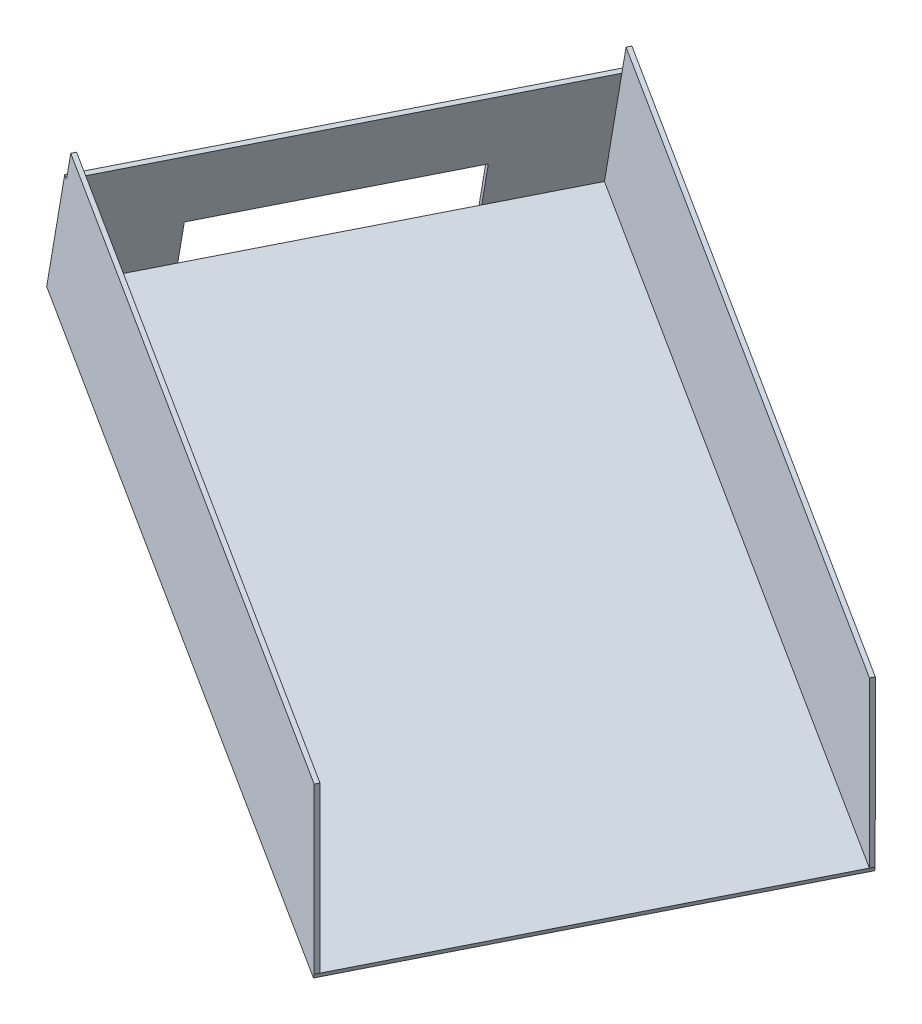
ISO-10303-21;
HEADER;
FILE_DESCRIPTION(('STEP AP214'),'2;1');
FILE_NAME('part.step','',(''),(''),'','','');
FILE_SCHEMA(('AUTOMOTIVE_DESIGN { 1 0 10303 214 1 1 1 1 }'));
ENDSEC;
DATA;
#1=APPLICATION_CONTEXT('core data for automotive mechanical design processes');
#2=APPLICATION_PROTOCOL_DEFINITION('international standard','automotive_design',2000,#1);
#3=PRODUCT_CONTEXT('',#1,'mechanical');
#4=PRODUCT('Part','Part','',(#3));
#5=PRODUCT_RELATED_PRODUCT_CATEGORY('part','',(#4));
#6=PRODUCT_DEFINITION_FORMATION('','',#4);
#7=PRODUCT_DEFINITION_CONTEXT('part definition',#1,'design');
#8=PRODUCT_DEFINITION('design','',#6,#7);
#9=PRODUCT_DEFINITION_SHAPE('','',#8);
#10=(LENGTH_UNIT() NAMED_UNIT(*) SI_UNIT(.MILLI.,.METRE.));
#11=(NAMED_UNIT(*) PLANE_ANGLE_UNIT() SI_UNIT($,.RADIAN.));
#12=(NAMED_UNIT(*) SI_UNIT($,.STERADIAN.) SOLID_ANGLE_UNIT());
#13=UNCERTAINTY_MEASURE_WITH_UNIT(LENGTH_MEASURE(1.E-05),#10,'distance_accuracy_value','');
#14=(GEOMETRIC_REPRESENTATION_CONTEXT(3) GLOBAL_UNCERTAINTY_ASSIGNED_CONTEXT((#13)) GLOBAL_UNIT_ASSIGNED_CONTEXT((#10,
#11,#12)) REPRESENTATION_CONTEXT('',''));
#15=CARTESIAN_POINT('',(0.,0.,0.));
#16=DIRECTION('',(0.,0.,1.));
#17=DIRECTION('',(1.,0.,0.));
#18=AXIS2_PLACEMENT_3D('',#15,#16,#17);
#19=CARTESIAN_POINT('',(-1582.31352976464,1675.1024913137,-8281.54614075704));
#20=DIRECTION('',(-0.849422273475724,0.310266919073999,-0.426867942403339));
#21=DIRECTION('',(-0.449027691255792,0.,0.893517841167983));
#22=AXIS2_PLACEMENT_3D('',#19,#20,#21);
#23=PLANE('',#22);
#24=DIRECTION('',(-0.449027691255792,0.,0.893517841167983));
#25=VECTOR('',#24,1.);
#26=CARTESIAN_POINT('',(-4783.0423725863,999.259321987561,-2403.66602074069));
#27=LINE('',#26,#25);
#28=CARTESIAN_POINT('',(-2297.24573428667,999.259321987562,-7350.13967724141));
#29=VERTEX_POINT('',#28);
#30=CARTESIAN_POINT('',(-2445.51467793934,999.259321987562,-7055.10008608774));
#31=VERTEX_POINT('',#30);
#32=EDGE_CURVE('E184',#29,#31,#27,.T.);
#33=ORIENTED_EDGE('',*,*,#32,.T.);
#34=DIRECTION('',(-0.277229027716841,-0.950649482684511,-0.139318438344846));
#35=VECTOR('',#34,1.);
#36=CARTESIAN_POINT('',(-2248.42484816079,1675.10249131371,-6956.05473169417));
#37=LINE('',#36,#35);
#38=CARTESIAN_POINT('',(-2466.63952985136,926.819831407002,-7065.71615108962));
#39=VERTEX_POINT('',#38);
#40=EDGE_CURVE('E178',#31,#39,#37,.T.);
#41=ORIENTED_EDGE('',*,*,#40,.T.);
#42=DIRECTION('',(-0.449027691255792,0.,0.893517841167983));
#43=VECTOR('',#42,1.);
#44=CARTESIAN_POINT('',(-1800.52821145521,926.819831407,-8391.20756015249));
#45=LINE('',#44,#43);
#46=CARTESIAN_POINT('',(-2529.36869831979,926.819831407,-6940.89170867845));
#47=VERTEX_POINT('',#46);
#48=EDGE_CURVE('E175',#39,#47,#45,.T.);
#49=ORIENTED_EDGE('',*,*,#48,.T.);
#50=DIRECTION('',(-0.277229027716841,-0.950649482684511,-0.139318438344846));
#51=VECTOR('',#50,1.);
#52=CARTESIAN_POINT('',(-2311.15401662922,1675.1024913137,-6831.23028928301));
#53=LINE('',#52,#51);
#54=CARTESIAN_POINT('',(-2476.55656853973,1107.9185578584,-6914.35154617376));
#55=VERTEX_POINT('',#54);
#56=EDGE_CURVE('E337',#55,#47,#53,.T.);
#57=ORIENTED_EDGE('',*,*,#56,.F.);
#58=DIRECTION('',(-0.449027691255792,0.,0.893517841167983));
#59=VECTOR('',#58,1.);
#60=CARTESIAN_POINT('',(-1747.71608167515,1107.9185578584,-8364.66739764779));
#61=LINE('',#60,#59);
#62=CARTESIAN_POINT('',(-2202.8292879502,1107.9185578584,-7459.04002214976));
#63=VERTEX_POINT('',#62);
#64=EDGE_CURVE('E263',#63,#55,#61,.T.);
#65=ORIENTED_EDGE('',*,*,#64,.F.);
#66=DIRECTION('',(0.277229027716841,0.950649482684511,0.139318438344846));
#67=VECTOR('',#66,1.);
#68=CARTESIAN_POINT('',(-2037.42673603969,1675.1024913137,-7375.91876525901));
#69=LINE('',#68,#67);
#70=CARTESIAN_POINT('',(-2255.64141773026,926.819831407,-7485.58018465445));
#71=VERTEX_POINT('',#70);
#72=EDGE_CURVE('E44',#71,#63,#69,.T.);
#73=ORIENTED_EDGE('',*,*,#72,.F.);
#74=CARTESIAN_POINT('',(-2318.37058619869,926.819831407,-7360.75574224329));
#75=VERTEX_POINT('',#74);
#76=EDGE_CURVE('E245',#71,#75,#45,.T.);
#77=ORIENTED_EDGE('',*,*,#76,.T.);
#78=DIRECTION('',(0.277229027716841,0.950649482684511,0.139318438344846));
#79=VECTOR('',#78,1.);
#80=CARTESIAN_POINT('',(-2100.15590450812,1675.10249131371,-7251.09432284784));
#81=LINE('',#80,#79);
#82=EDGE_CURVE('E52',#75,#29,#81,.T.);
#83=ORIENTED_EDGE('',*,*,#82,.T.);
#84=EDGE_LOOP('',(#33,#41,#49,#57,#65,#73,#77,#83));
#85=FACE_BOUND('',#84,.T.);
#86=ADVANCED_FACE('F35',(#85),#23,.T.);
#87=CARTESIAN_POINT('',(2785.42433135297,-748.282659905749,-6086.58689380516));
#88=DIRECTION('',(-0.277229027716676,-0.950649482684571,-0.139318438344762));
#89=DIRECTION('',(0.960011871714968,-0.279959293766653,0.));
#90=AXIS2_PLACEMENT_3D('',#87,#88,#89);
#91=PLANE('',#90);
#92=ORIENTED_EDGE('',*,*,#48,.F.);
#93=DIRECTION('',(-0.849422273475724,0.310266919073999,-0.426867942403339));
#94=VECTOR('',#93,1.);
#95=CARTESIAN_POINT('',(-2158.09937485804,814.119933735756,-6910.66264563834));
#96=LINE('',#95,#94);
#97=CARTESIAN_POINT('',(-2461.24569841478,924.84963647088,-7063.00553965536));
#98=VERTEX_POINT('',#97);
#99=EDGE_CURVE('E159',#98,#39,#96,.T.);
#100=ORIENTED_EDGE('',*,*,#99,.F.);
#101=DIRECTION('',(-0.449027691255792,0.,0.893517841167983));
#102=VECTOR('',#101,1.);
#103=CARTESIAN_POINT('',(-4798.77339306175,924.84963647088,-2411.5714743083));
#104=LINE('',#103,#102);
#105=CARTESIAN_POINT('',(-2312.97675476212,924.84963647088,-7358.04513080903));
#106=VERTEX_POINT('',#105);
#107=EDGE_CURVE('E166',#106,#98,#104,.T.);
#108=ORIENTED_EDGE('',*,*,#107,.F.);
#109=DIRECTION('',(-0.849422273475724,0.310266919073999,-0.426867942403339));
#110=VECTOR('',#109,1.);
#111=CARTESIAN_POINT('',(-2009.83043120538,814.119933735756,-7205.70223679201));
#112=LINE('',#111,#110);
#113=EDGE_CURVE('E182',#106,#75,#112,.T.);
#114=ORIENTED_EDGE('',*,*,#113,.T.);
#115=ORIENTED_EDGE('',*,*,#76,.F.);
#116=DIRECTION('',(-0.849422273475778,0.310266919073814,-0.426867942403366));
#117=VECTOR('',#116,1.);
#118=CARTESIAN_POINT('',(2330.31112507791,-748.282659905749,-5180.95951830712));
#119=LINE('',#118,#117);
#120=CARTESIAN_POINT('',(-1473.53585942748,641.141565669802,-7092.54152668658));
#121=VERTEX_POINT('',#120);
#122=EDGE_CURVE('E11',#121,#71,#119,.T.);
#123=ORIENTED_EDGE('',*,*,#122,.F.);
#124=DIRECTION('',(-0.449027691255792,0.,0.893517841167983));
#125=VECTOR('',#124,1.);
#126=CARTESIAN_POINT('',(-1018.42265315243,641.141565669801,-7998.16890218461));
#127=LINE('',#126,#125);
#128=CARTESIAN_POINT('',(-1747.26314001701,641.141565669801,-6547.85305071058));
#129=VERTEX_POINT('',#128);
#130=EDGE_CURVE('E239',#121,#129,#127,.T.);
#131=ORIENTED_EDGE('',*,*,#130,.T.);
#132=DIRECTION('',(0.849422273475778,-0.310266919073814,0.426867942403366));
#133=VECTOR('',#132,1.);
#134=CARTESIAN_POINT('',(2056.58384448839,-748.282659905749,-4636.27104233112));
#135=LINE('',#134,#133);
#136=EDGE_CURVE('E339',#47,#129,#135,.T.);
#137=ORIENTED_EDGE('',*,*,#136,.F.);
#138=EDGE_LOOP('',(#92,#100,#108,#114,#115,#123,#131,#137));
#139=FACE_BOUND('',#138,.T.);
#140=ADVANCED_FACE('F173',(#139),#91,.T.);
#141=CARTESIAN_POINT('',(-1584.23978256921,1673.1322963776,-8264.26933219134));
#142=DIRECTION('',(0.849422273475723,-0.310266919074003,0.426867942403338));
#143=DIRECTION('',(0.449027691255792,0.,-0.893517841167983));
#144=AXIS2_PLACEMENT_3D('',#141,#142,#143);
#145=PLANE('',#144);
#146=DIRECTION('',(-0.449027691255792,0.,0.893517841167983));
#147=VECTOR('',#146,1.);
#148=CARTESIAN_POINT('',(-1800.69405993377,930.886260685959,-8373.0460795033));
#149=LINE('',#148,#147);
#150=CARTESIAN_POINT('',(-2459.48529408879,930.886260685959,-7062.12086757187));
#151=VERTEX_POINT('',#150);
#152=CARTESIAN_POINT('',(-2519.36313671775,930.886260685959,-6942.97026345212));
#153=VERTEX_POINT('',#152);
#154=EDGE_CURVE('E38',#151,#153,#149,.T.);
#155=ORIENTED_EDGE('',*,*,#154,.F.);
#156=DIRECTION('',(-0.277229027716844,-0.95064948268451,-0.139318438344848));
#157=VECTOR('',#156,1.);
#158=CARTESIAN_POINT('',(-2243.03101672421,1673.13229637759,-6953.34412025991));
#159=LINE('',#158,#157);
#160=CARTESIAN_POINT('',(-2440.12084650276,997.28912705144,-7052.38947465348));
#161=VERTEX_POINT('',#160);
#162=EDGE_CURVE('E60',#161,#151,#159,.T.);
#163=ORIENTED_EDGE('',*,*,#162,.F.);
#164=DIRECTION('',(-0.449027691255792,0.,0.893517841167983));
#165=VECTOR('',#164,1.);
#166=CARTESIAN_POINT('',(-4777.64854114973,997.289127051439,-2400.95540930642));
#167=LINE('',#166,#165);
#168=CARTESIAN_POINT('',(-2291.8519028501,997.28912705144,-7347.42906580715));
#169=VERTEX_POINT('',#168);
#170=EDGE_CURVE('E163',#169,#161,#167,.T.);
#171=ORIENTED_EDGE('',*,*,#170,.F.);
#172=DIRECTION('',(0.277229027716844,0.95064948268451,0.139318438344848));
#173=VECTOR('',#172,1.);
#174=CARTESIAN_POINT('',(-2094.76207307155,1673.13229637759,-7248.38371141358));
#175=LINE('',#174,#173);
#176=CARTESIAN_POINT('',(-2311.21635043611,930.886260685955,-7357.16045872553));
#177=VERTEX_POINT('',#176);
#178=EDGE_CURVE('E308',#177,#169,#175,.T.);
#179=ORIENTED_EDGE('',*,*,#178,.F.);
#180=CARTESIAN_POINT('',(-2251.33850780716,930.886260685959,-7476.31106284529));
#181=VERTEX_POINT('',#180);
#182=EDGE_CURVE('E212',#181,#177,#149,.T.);
#183=ORIENTED_EDGE('',*,*,#182,.F.);
#184=DIRECTION('',(-0.277229027716844,-0.95064948268451,-0.139318438344847));
#185=VECTOR('',#184,1.);
#186=CARTESIAN_POINT('',(-2034.8842304426,1673.1322963776,-7367.53431553333));
#187=LINE('',#186,#185);
#188=CARTESIAN_POINT('',(-2200.28678235312,1105.94836292228,-7450.65557242409));
#189=VERTEX_POINT('',#188);
#190=EDGE_CURVE('E198',#189,#181,#187,.T.);
#191=ORIENTED_EDGE('',*,*,#190,.F.);
#192=DIRECTION('',(0.449027691255792,0.,-0.893517841167983));
#193=VECTOR('',#192,1.);
#194=CARTESIAN_POINT('',(-1742.32225023859,1105.94836292228,-8361.95678621354));
#195=LINE('',#194,#193);
#196=CARTESIAN_POINT('',(-2468.3114112637,1105.94836292228,-6917.31477303092));
#197=VERTEX_POINT('',#196);
#198=EDGE_CURVE('E194',#197,#189,#195,.T.);
#199=ORIENTED_EDGE('',*,*,#198,.F.);
#200=DIRECTION('',(0.277229027716845,0.95064948268451,0.139318438344847));
#201=VECTOR('',#200,1.);
#202=CARTESIAN_POINT('',(-2302.90885935318,1673.1322963776,-6834.19351614016));
#203=LINE('',#202,#201);
#204=EDGE_CURVE('E223',#153,#197,#203,.T.);
#205=ORIENTED_EDGE('',*,*,#204,.F.);
#206=EDGE_LOOP('',(#155,#163,#171,#179,#183,#191,#199,#205));
#207=FACE_BOUND('',#206,.T.);
#208=ADVANCED_FACE('F306',(#207),#145,.T.);
#209=CARTESIAN_POINT('',(-1576.91969832807,1673.13229637761,-8278.83552932278));
#210=DIRECTION('',(-0.849422273475723,0.310266919074003,-0.426867942403338));
#211=DIRECTION('',(-0.449027691255792,0.,0.893517841167983));
#212=AXIS2_PLACEMENT_3D('',#209,#210,#211);
#213=PLANE('',#212);
#214=DIRECTION('',(-0.449027691255792,0.,0.893517841167983));
#215=VECTOR('',#214,1.);
#216=CARTESIAN_POINT('',(-1729.99941995657,1148.20473242763,-8355.76408162911));
#217=LINE('',#216,#215);
#218=CARTESIAN_POINT('',(-2455.98858098168,1148.20473242763,-6911.12206844649));
#219=VERTEX_POINT('',#218);
#220=CARTESIAN_POINT('',(-2458.83990682115,1148.20473242763,-6905.44823015507));
#221=VERTEX_POINT('',#220);
#222=EDGE_CURVE('E277',#219,#221,#217,.T.);
#223=ORIENTED_EDGE('',*,*,#222,.F.);
#224=EDGE_CURVE('E326',#197,#219,#203,.T.);
#225=ORIENTED_EDGE('',*,*,#224,.F.);
#226=DIRECTION('',(-0.449027691255792,0.,0.893517841167983));
#227=VECTOR('',#226,1.);
#228=CARTESIAN_POINT('',(-1742.32225023859,1105.94836292228,-8361.95678621354));
#229=LINE('',#228,#227);
#230=CARTESIAN_POINT('',(-2471.16273710317,1105.94836292228,-6911.6409347395));
#231=VERTEX_POINT('',#230);
#232=EDGE_CURVE('E267',#197,#231,#229,.T.);
#233=ORIENTED_EDGE('',*,*,#232,.T.);
#234=DIRECTION('',(-0.277229027716844,-0.95064948268451,-0.139318438344847));
#235=VECTOR('',#234,1.);
#236=CARTESIAN_POINT('',(-2305.76018519265,1673.13229637761,-6828.51967784875));
#237=LINE('',#236,#235);
#238=EDGE_CURVE('E253',#221,#231,#237,.T.);
#239=ORIENTED_EDGE('',*,*,#238,.F.);
#240=EDGE_LOOP('',(#223,#225,#233,#239));
#241=FACE_BOUND('',#240,.T.);
#242=ADVANCED_FACE('F331',(#241),#213,.T.);
#243=CARTESIAN_POINT('',(-2197.43545651364,1105.94836292228,-7456.3294107155));
#244=VERTEX_POINT('',#243);
#245=EDGE_CURVE('E265',#244,#189,#229,.T.);
#246=ORIENTED_EDGE('',*,*,#245,.T.);
#247=CARTESIAN_POINT('',(-2187.9639520711,1148.20473242763,-7444.46286783966));
#248=VERTEX_POINT('',#247);
#249=EDGE_CURVE('E201',#248,#189,#187,.T.);
#250=ORIENTED_EDGE('',*,*,#249,.F.);
#251=CARTESIAN_POINT('',(-2185.1126262316,1148.20473242763,-7450.13670613106));
#252=VERTEX_POINT('',#251);
#253=EDGE_CURVE('E234',#252,#248,#217,.T.);
#254=ORIENTED_EDGE('',*,*,#253,.F.);
#255=DIRECTION('',(0.277229027716844,0.95064948268451,0.139318438344847));
#256=VECTOR('',#255,1.);
#257=CARTESIAN_POINT('',(-2032.03290460312,1673.13229637761,-7373.20815382475));
#258=LINE('',#257,#256);
#259=EDGE_CURVE('E366',#244,#252,#258,.T.);
#260=ORIENTED_EDGE('',*,*,#259,.F.);
#261=EDGE_LOOP('',(#246,#250,#254,#260));
#262=FACE_BOUND('',#261,.T.);
#263=ADVANCED_FACE('F300',(#262),#213,.T.);
#264=CARTESIAN_POINT('',(2850.55929141462,-524.927563949967,-6053.85402671625));
#265=DIRECTION('',(0.277229027716844,0.95064948268451,0.139318438344847));
#266=DIRECTION('',(-0.960011871714918,0.279959293766827,0.));
#267=AXIS2_PLACEMENT_3D('',#264,#265,#266);
#268=PLANE('',#267);
#269=DIRECTION('',(-0.449027691255792,0.,0.893517841167983));
#270=VECTOR('',#269,1.);
#271=CARTESIAN_POINT('',(-1016.37992767892,887.542246672293,-7997.14235267326));
#272=LINE('',#271,#270);
#273=CARTESIAN_POINT('',(-1742.36908870403,887.542246672293,-6552.50033949064));
#274=VERTEX_POINT('',#273);
#275=CARTESIAN_POINT('',(-1745.22041454351,887.542246672293,-6546.82650119922));
#276=VERTEX_POINT('',#275);
#277=EDGE_CURVE('E225',#274,#276,#272,.T.);
#278=ORIENTED_EDGE('',*,*,#277,.F.);
#279=DIRECTION('',(-0.849422273475732,0.310266919073972,-0.426867942403343));
#280=VECTOR('',#279,1.);
#281=CARTESIAN_POINT('',(2124.57013038957,-524.927563949814,-4609.2120135336));
#282=LINE('',#281,#280);
#283=EDGE_CURVE('E187',#274,#219,#282,.T.);
#284=ORIENTED_EDGE('',*,*,#283,.T.);
#285=ORIENTED_EDGE('',*,*,#222,.T.);
#286=DIRECTION('',(-0.849422273475723,0.310266919074003,-0.426867942403338));
#287=VECTOR('',#286,1.);
#288=CARTESIAN_POINT('',(2121.71880455004,-524.927563949967,-4603.53817524221));
#289=LINE('',#288,#287);
#290=EDGE_CURVE('E259',#276,#221,#289,.T.);
#291=ORIENTED_EDGE('',*,*,#290,.F.);
#292=EDGE_LOOP('',(#278,#284,#285,#291));
#293=FACE_BOUND('',#292,.T.);
#294=ADVANCED_FACE('F353',(#293),#268,.T.);
#295=ORIENTED_EDGE('',*,*,#253,.T.);
#296=DIRECTION('',(0.849422273475732,-0.310266919073972,0.426867942403343));
#297=VECTOR('',#296,1.);
#298=CARTESIAN_POINT('',(2392.59475930015,-524.927563949814,-5142.55281292677));
#299=LINE('',#298,#297);
#300=CARTESIAN_POINT('',(-1474.34445979345,887.542246672293,-7085.8411388838));
#301=VERTEX_POINT('',#300);
#302=EDGE_CURVE('E190',#248,#301,#299,.T.);
#303=ORIENTED_EDGE('',*,*,#302,.T.);
#304=CARTESIAN_POINT('',(-1471.49313395398,887.542246672293,-7091.51497717522));
#305=VERTEX_POINT('',#304);
#306=EDGE_CURVE('E228',#305,#301,#272,.T.);
#307=ORIENTED_EDGE('',*,*,#306,.F.);
#308=DIRECTION('',(0.849422273475723,-0.310266919074003,0.426867942403339));
#309=VECTOR('',#308,1.);
#310=CARTESIAN_POINT('',(2395.44608513957,-524.927563949967,-5148.22665121822));
#311=LINE('',#310,#309);
#312=EDGE_CURVE('E294',#252,#305,#311,.T.);
#313=ORIENTED_EDGE('',*,*,#312,.F.);
#314=EDGE_LOOP('',(#295,#303,#307,#313));
#315=FACE_BOUND('',#314,.T.);
#316=ADVANCED_FACE('F293',(#315),#268,.T.);
#317=CARTESIAN_POINT('',(-1017.41544778491,5.91571691095366,-7997.66274206115));
#318=DIRECTION('',(0.893517069173879,-0.00131452933249969,0.449027303298536));
#319=DIRECTION('',(0.449027691255792,0.,-0.893517841167983));
#320=AXIS2_PLACEMENT_3D('',#317,#318,#319);
#321=PLANE('',#320);
#322=DIRECTION('',(-0.449027691255792,0.,0.893517841167983));
#323=VECTOR('',#322,1.);
#324=CARTESIAN_POINT('',(-1016.66224882644,647.178189884691,-7997.28423010113));
#325=LINE('',#324,#323);
#326=CARTESIAN_POINT('',(-1742.65140985155,647.178189884813,-6552.64221691851));
#327=VERTEX_POINT('',#326);
#328=CARTESIAN_POINT('',(-1745.50273569102,647.178189884691,-6546.96837862709));
#329=VERTEX_POINT('',#328);
#330=EDGE_CURVE('E242',#327,#329,#325,.T.);
#331=ORIENTED_EDGE('',*,*,#330,.F.);
#332=DIRECTION('',(-0.00117455541172512,-0.999999136005943,-0.00059026007146012));
#333=VECTOR('',#332,1.);
#334=CARTESIAN_POINT('',(-1743.40460881027,5.91571691295644,-6553.02072887866));
#335=LINE('',#334,#333);
#336=EDGE_CURVE('E318',#274,#327,#335,.T.);
#337=ORIENTED_EDGE('',*,*,#336,.F.);
#338=ORIENTED_EDGE('',*,*,#277,.T.);
#339=DIRECTION('',(0.00117455541132706,0.999999136005944,0.000590260071260452));
#340=VECTOR('',#339,1.);
#341=CARTESIAN_POINT('',(-1746.25593464949,5.91571691095366,-6547.34689058712));
#342=LINE('',#341,#340);
#343=EDGE_CURVE('E348',#329,#276,#342,.T.);
#344=ORIENTED_EDGE('',*,*,#343,.F.);
#345=EDGE_LOOP('',(#331,#337,#338,#344));
#346=FACE_BOUND('',#345,.T.);
#347=ADVANCED_FACE('F355',(#346),#321,.T.);
#348=ORIENTED_EDGE('',*,*,#306,.T.);
#349=DIRECTION('',(0.00117455541172502,0.999999136005943,0.000590260071460319));
#350=VECTOR('',#349,1.);
#351=CARTESIAN_POINT('',(-1475.37997989969,5.91571691295644,-7086.36152827183));
#352=LINE('',#351,#350);
#353=CARTESIAN_POINT('',(-1474.62678094096,647.178189884691,-7085.98301631167));
#354=VERTEX_POINT('',#353);
#355=EDGE_CURVE('E195',#354,#301,#352,.T.);
#356=ORIENTED_EDGE('',*,*,#355,.F.);
#357=CARTESIAN_POINT('',(-1471.77545510153,647.178189884691,-7091.65685460311));
#358=VERTEX_POINT('',#357);
#359=EDGE_CURVE('E229',#358,#354,#325,.T.);
#360=ORIENTED_EDGE('',*,*,#359,.F.);
#361=DIRECTION('',(-0.00117455541132711,-0.999999136005944,-0.000590260071260353));
#362=VECTOR('',#361,1.);
#363=CARTESIAN_POINT('',(-1472.52865405996,5.91571691095366,-7092.03536656312));
#364=LINE('',#363,#362);
#365=EDGE_CURVE('E292',#305,#358,#364,.T.);
#366=ORIENTED_EDGE('',*,*,#365,.F.);
#367=EDGE_LOOP('',(#348,#356,#360,#366));
#368=FACE_BOUND('',#367,.T.);
#369=ADVANCED_FACE('F290',(#368),#321,.T.);
#370=CARTESIAN_POINT('',(2838.23646113263,-567.18393345525,-6060.04673130067));
#371=DIRECTION('',(0.277229027716832,0.950649482684514,0.139318438344841));
#372=DIRECTION('',(-0.960011871714921,0.279959293766814,0.));
#373=AXIS2_PLACEMENT_3D('',#370,#371,#372);
#374=PLANE('',#373);
#375=DIRECTION('',(0.849422273475727,-0.310266919073989,0.426867942403341));
#376=VECTOR('',#375,1.);
#377=CARTESIAN_POINT('',(2383.12325485757,-567.18393345525,-5154.41935580263));
#378=LINE('',#377,#376);
#379=EDGE_CURVE('E336',#63,#244,#378,.T.);
#380=ORIENTED_EDGE('',*,*,#379,.F.);
#381=ORIENTED_EDGE('',*,*,#64,.T.);
#382=DIRECTION('',(-0.849422273475727,0.310266919073989,-0.42686794240334));
#383=VECTOR('',#382,1.);
#384=CARTESIAN_POINT('',(2109.39597426804,-567.18393345525,-4609.73087982663));
#385=LINE('',#384,#383);
#386=EDGE_CURVE('E250',#231,#55,#385,.T.);
#387=ORIENTED_EDGE('',*,*,#386,.F.);
#388=ORIENTED_EDGE('',*,*,#232,.F.);
#389=ORIENTED_EDGE('',*,*,#198,.T.);
#390=ORIENTED_EDGE('',*,*,#245,.F.);
#391=EDGE_LOOP('',(#380,#381,#387,#388,#389,#390));
#392=FACE_BOUND('',#391,.T.);
#393=ADVANCED_FACE('F334',(#392),#374,.T.);
#394=CARTESIAN_POINT('',(-800.207971461819,1389.42422557652,-7888.50748278915));
#395=DIRECTION('',(0.849422273475712,-0.310266919074043,0.426867942403333));
#396=DIRECTION('',(0.449027691255792,0.,-0.893517841167983));
#397=AXIS2_PLACEMENT_3D('',#394,#395,#396);
#398=PLANE('',#397);
#399=DIRECTION('',(-0.27722902771688,-0.950649482684497,-0.139318438344865));
#400=VECTOR('',#399,1.);
#401=CARTESIAN_POINT('',(-1255.32117773687,1389.42422557652,-6982.88010729111));
#402=LINE('',#401,#400);
#403=EDGE_CURVE('E264',#358,#121,#402,.T.);
#404=ORIENTED_EDGE('',*,*,#403,.F.);
#405=ORIENTED_EDGE('',*,*,#359,.T.);
#406=DIRECTION('',(-0.449027691255792,0.,0.893517841167983));
#407=VECTOR('',#406,1.);
#408=CARTESIAN_POINT('',(-1023.98233306757,647.178189884691,-7982.71803296968));
#409=LINE('',#408,#407);
#410=EDGE_CURVE('E202',#354,#327,#409,.T.);
#411=ORIENTED_EDGE('',*,*,#410,.T.);
#412=ORIENTED_EDGE('',*,*,#330,.T.);
#413=DIRECTION('',(0.27722902771688,0.950649482684497,0.139318438344865));
#414=VECTOR('',#413,1.);
#415=CARTESIAN_POINT('',(-1529.0484583264,1389.42422557652,-6438.19163131511));
#416=LINE('',#415,#414);
#417=EDGE_CURVE('E341',#129,#329,#416,.T.);
#418=ORIENTED_EDGE('',*,*,#417,.F.);
#419=ORIENTED_EDGE('',*,*,#130,.F.);
#420=EDGE_LOOP('',(#404,#405,#411,#412,#418,#419));
#421=FACE_BOUND('',#420,.T.);
#422=ADVANCED_FACE('F359',(#421),#398,.T.);
#423=CARTESIAN_POINT('',(2274.79852617853,5.62444978189127E-13,-4526.60962293589));
#424=DIRECTION('',(-0.449027691255792,0.,0.893517841167983));
#425=DIRECTION('',(0.893517841167983,0.,0.449027691255792));
#426=AXIS2_PLACEMENT_3D('',#423,#424,#425);
#427=PLANE('',#426);
#428=ORIENTED_EDGE('',*,*,#56,.T.);
#429=ORIENTED_EDGE('',*,*,#136,.T.);
#430=ORIENTED_EDGE('',*,*,#417,.T.);
#431=ORIENTED_EDGE('',*,*,#343,.T.);
#432=ORIENTED_EDGE('',*,*,#290,.T.);
#433=ORIENTED_EDGE('',*,*,#238,.T.);
#434=ORIENTED_EDGE('',*,*,#386,.T.);
#435=EDGE_LOOP('',(#428,#429,#430,#431,#432,#433,#434));
#436=FACE_BOUND('',#435,.T.);
#437=ADVANCED_FACE('F351',(#436),#427,.T.);
#438=CARTESIAN_POINT('',(-2031.66997643576,1142.25434570137,-7373.02576821411));
#439=DIRECTION('',(-0.449027691255792,0.,0.893517841167983));
#440=DIRECTION('',(0.277229027716844,0.95064948268451,0.139318438344847));
#441=AXIS2_PLACEMENT_3D('',#438,#439,#440);
#442=PLANE('',#441);
#443=ORIENTED_EDGE('',*,*,#72,.T.);
#444=ORIENTED_EDGE('',*,*,#379,.T.);
#445=ORIENTED_EDGE('',*,*,#259,.T.);
#446=ORIENTED_EDGE('',*,*,#312,.T.);
#447=ORIENTED_EDGE('',*,*,#365,.T.);
#448=ORIENTED_EDGE('',*,*,#403,.T.);
#449=ORIENTED_EDGE('',*,*,#122,.T.);
#450=EDGE_LOOP('',(#443,#444,#445,#446,#447,#448,#449));
#451=FACE_BOUND('',#450,.T.);
#452=ADVANCED_FACE('F367',(#451),#442,.F.);
#453=CARTESIAN_POINT('',(2277.64985201801,-1.12629993961953E-12,-4532.28346122731));
#454=DIRECTION('',(0.449027691255792,0.,-0.893517841167983));
#455=DIRECTION('',(-0.893517841167983,0.,-0.449027691255792));
#456=AXIS2_PLACEMENT_3D('',#453,#454,#455);
#457=PLANE('',#456);
#458=ORIENTED_EDGE('',*,*,#283,.F.);
#459=ORIENTED_EDGE('',*,*,#336,.T.);
#460=DIRECTION('',(-0.849422273475723,0.310266919074003,-0.426867942403338));
#461=VECTOR('',#460,1.);
#462=CARTESIAN_POINT('',(2061.19557465344,-742.246035691646,-4641.06020853926));
#463=LINE('',#462,#461);
#464=EDGE_CURVE('E321',#327,#153,#463,.T.);
#465=ORIENTED_EDGE('',*,*,#464,.T.);
#466=ORIENTED_EDGE('',*,*,#204,.T.);
#467=ORIENTED_EDGE('',*,*,#224,.T.);
#468=EDGE_LOOP('',(#458,#459,#465,#466,#467));
#469=FACE_BOUND('',#468,.T.);
#470=ADVANCED_FACE('F330',(#469),#457,.T.);
#471=CARTESIAN_POINT('',(2779.86465143741,-742.246035691646,-6071.13602459044));
#472=DIRECTION('',(0.277229027716844,0.95064948268451,0.139318438344847));
#473=DIRECTION('',(-0.960011871714918,0.279959293766827,0.));
#474=AXIS2_PLACEMENT_3D('',#471,#472,#473);
#475=PLANE('',#474);
#476=ORIENTED_EDGE('',*,*,#182,.T.);
#477=EDGE_CURVE('E218',#177,#151,#149,.T.);
#478=ORIENTED_EDGE('',*,*,#477,.T.);
#479=ORIENTED_EDGE('',*,*,#154,.T.);
#480=ORIENTED_EDGE('',*,*,#464,.F.);
#481=ORIENTED_EDGE('',*,*,#410,.F.);
#482=DIRECTION('',(0.849422273475723,-0.310266919074003,0.426867942403338));
#483=VECTOR('',#482,1.);
#484=CARTESIAN_POINT('',(2329.22020356402,-742.246035691646,-5174.40100793243));
#485=LINE('',#484,#483);
#486=EDGE_CURVE('E301',#181,#354,#485,.T.);
#487=ORIENTED_EDGE('',*,*,#486,.F.);
#488=EDGE_LOOP('',(#476,#478,#479,#480,#481,#487));
#489=FACE_BOUND('',#488,.T.);
#490=ADVANCED_FACE('F303',(#489),#475,.T.);
#491=CARTESIAN_POINT('',(-2034.52130227524,1142.25434570137,-7367.35192992269));
#492=DIRECTION('',(-0.449027691255792,0.,0.893517841167983));
#493=DIRECTION('',(0.277229027716844,0.95064948268451,0.139318438344847));
#494=AXIS2_PLACEMENT_3D('',#491,#492,#493);
#495=PLANE('',#494);
#496=ORIENTED_EDGE('',*,*,#249,.T.);
#497=ORIENTED_EDGE('',*,*,#190,.T.);
#498=ORIENTED_EDGE('',*,*,#486,.T.);
#499=ORIENTED_EDGE('',*,*,#355,.T.);
#500=ORIENTED_EDGE('',*,*,#302,.F.);
#501=EDGE_LOOP('',(#496,#497,#498,#499,#500));
#502=FACE_BOUND('',#501,.T.);
#503=ADVANCED_FACE('F297',(#502),#495,.T.);
#504=CARTESIAN_POINT('',(-2360.70516169842,1015.39899969658,-7197.25525397984));
#505=DIRECTION('',(0.849422273475723,-0.310266919074003,0.426867942403338));
#506=DIRECTION('',(-0.449027691255792,0.,0.893517841167983));
#507=AXIS2_PLACEMENT_3D('',#504,#505,#506);
#508=PLANE('',#507);
#509=ORIENTED_EDGE('',*,*,#477,.F.);
#510=EDGE_CURVE('E169',#106,#177,#175,.T.);
#511=ORIENTED_EDGE('',*,*,#510,.F.);
#512=ORIENTED_EDGE('',*,*,#107,.T.);
#513=EDGE_CURVE('E154',#151,#98,#159,.T.);
#514=ORIENTED_EDGE('',*,*,#513,.F.);
#515=EDGE_LOOP('',(#509,#511,#512,#514));
#516=FACE_BOUND('',#515,.T.);
#517=ADVANCED_FACE('F167',(#516),#508,.F.);
#518=CARTESIAN_POINT('',(-1939.88469316747,1562.40259364246,-6801.0012262429));
#519=DIRECTION('',(0.449027691255792,0.,-0.893517841167983));
#520=DIRECTION('',(-0.893517841167983,0.,-0.449027691255792));
#521=AXIS2_PLACEMENT_3D('',#518,#519,#520);
#522=PLANE('',#521);
#523=ORIENTED_EDGE('',*,*,#162,.T.);
#524=ORIENTED_EDGE('',*,*,#513,.T.);
#525=ORIENTED_EDGE('',*,*,#99,.T.);
#526=ORIENTED_EDGE('',*,*,#40,.F.);
#527=DIRECTION('',(-0.849422273475724,0.310266919073999,-0.426867942403339));
#528=VECTOR('',#527,1.);
#529=CARTESIAN_POINT('',(-2136.97452294602,886.559424316316,-6900.04658063646));
#530=LINE('',#529,#528);
#531=EDGE_CURVE('E176',#161,#31,#530,.T.);
#532=ORIENTED_EDGE('',*,*,#531,.F.);
#533=EDGE_LOOP('',(#523,#524,#525,#526,#532));
#534=FACE_BOUND('',#533,.T.);
#535=ADVANCED_FACE('F156',(#534),#522,.T.);
#536=CARTESIAN_POINT('',(-4474.50221759299,886.559424316315,-2248.61251528941));
#537=DIRECTION('',(-0.277229027716841,-0.950649482684511,-0.139318438344846));
#538=DIRECTION('',(0.960011871714919,-0.279959293766823,0.));
#539=AXIS2_PLACEMENT_3D('',#536,#537,#538);
#540=PLANE('',#539);
#541=ORIENTED_EDGE('',*,*,#170,.T.);
#542=ORIENTED_EDGE('',*,*,#531,.T.);
#543=ORIENTED_EDGE('',*,*,#32,.F.);
#544=DIRECTION('',(-0.849422273475724,0.310266919073999,-0.426867942403339));
#545=VECTOR('',#544,1.);
#546=CARTESIAN_POINT('',(-1988.70557929336,886.559424316316,-7195.08617179013));
#547=LINE('',#546,#545);
#548=EDGE_CURVE('E313',#169,#29,#547,.T.);
#549=ORIENTED_EDGE('',*,*,#548,.F.);
#550=EDGE_LOOP('',(#541,#542,#543,#549));
#551=FACE_BOUND('',#550,.T.);
#552=ADVANCED_FACE('F370',(#551),#540,.T.);
#553=CARTESIAN_POINT('',(-1791.61574951481,1562.40259364246,-7096.04081739657));
#554=DIRECTION('',(-0.449027691255792,0.,0.893517841167983));
#555=DIRECTION('',(0.893517841167983,0.,0.449027691255792));
#556=AXIS2_PLACEMENT_3D('',#553,#554,#555);
#557=PLANE('',#556);
#558=ORIENTED_EDGE('',*,*,#510,.T.);
#559=ORIENTED_EDGE('',*,*,#178,.T.);
#560=ORIENTED_EDGE('',*,*,#548,.T.);
#561=ORIENTED_EDGE('',*,*,#82,.F.);
#562=ORIENTED_EDGE('',*,*,#113,.F.);
#563=EDGE_LOOP('',(#558,#559,#560,#561,#562));
#564=FACE_BOUND('',#563,.T.);
#565=ADVANCED_FACE('F368',(#564),#557,.T.);
#566=CLOSED_SHELL('',(#86,#140,#208,#242,#263,#294,#316,#347,#369,#393,#422,#437,#452,#470,#490,
#503,#517,#535,#552,#565));
#567=MANIFOLD_SOLID_BREP('B2',#566);
#568=ADVANCED_BREP_SHAPE_REPRESENTATION('',(#18,#567),#14);
#569=SHAPE_DEFINITION_REPRESENTATION(#9,#568);
ENDSEC;
END-ISO-10303-21;
